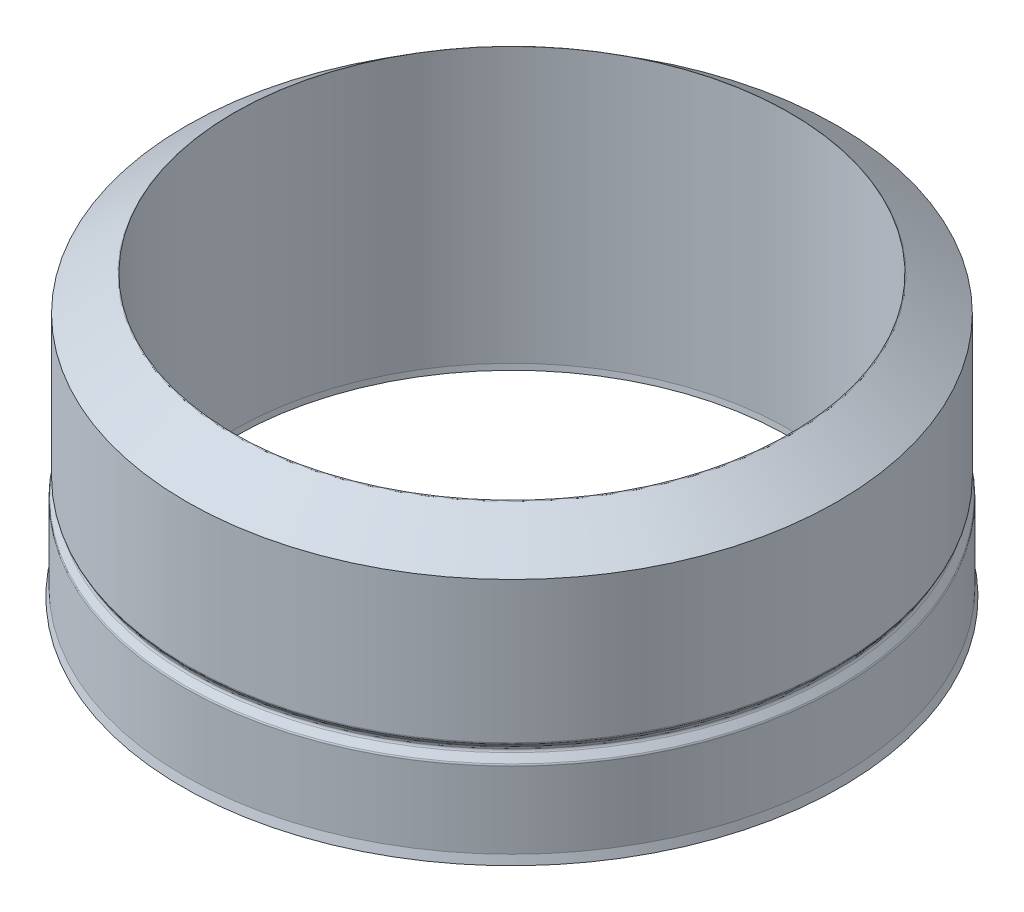
ISO-10303-21;
HEADER;
FILE_DESCRIPTION(('STEP AP214'),'2;1');
FILE_NAME('part.step','',(''),(''),'','','');
FILE_SCHEMA(('AUTOMOTIVE_DESIGN { 1 0 10303 214 1 1 1 1 }'));
ENDSEC;
DATA;
#1=APPLICATION_CONTEXT('core data for automotive mechanical design processes');
#2=APPLICATION_PROTOCOL_DEFINITION('international standard','automotive_design',2000,#1);
#3=PRODUCT_CONTEXT('',#1,'mechanical');
#4=PRODUCT('Part','Part','',(#3));
#5=PRODUCT_RELATED_PRODUCT_CATEGORY('part','',(#4));
#6=PRODUCT_DEFINITION_FORMATION('','',#4);
#7=PRODUCT_DEFINITION_CONTEXT('part definition',#1,'design');
#8=PRODUCT_DEFINITION('design','',#6,#7);
#9=PRODUCT_DEFINITION_SHAPE('','',#8);
#10=(LENGTH_UNIT() NAMED_UNIT(*) SI_UNIT(.MILLI.,.METRE.));
#11=(NAMED_UNIT(*) PLANE_ANGLE_UNIT() SI_UNIT($,.RADIAN.));
#12=(NAMED_UNIT(*) SI_UNIT($,.STERADIAN.) SOLID_ANGLE_UNIT());
#13=UNCERTAINTY_MEASURE_WITH_UNIT(LENGTH_MEASURE(1.E-05),#10,'distance_accuracy_value','');
#14=(GEOMETRIC_REPRESENTATION_CONTEXT(3) GLOBAL_UNCERTAINTY_ASSIGNED_CONTEXT((#13)) GLOBAL_UNIT_ASSIGNED_CONTEXT((#10,
#11,#12)) REPRESENTATION_CONTEXT('',''));
#15=CARTESIAN_POINT('',(0.,0.,0.));
#16=DIRECTION('',(0.,0.,1.));
#17=DIRECTION('',(1.,0.,0.));
#18=AXIS2_PLACEMENT_3D('',#15,#16,#17);
#19=CARTESIAN_POINT('',(-3.20576898360514E-12,-99.9999983932194,0.));
#20=DIRECTION('',(0.,1.,0.));
#21=DIRECTION('',(-1.,0.,0.));
#22=AXIS2_PLACEMENT_3D('',#19,#20,#21);
#23=CONICAL_SURFACE('',#22,198.000371507381,0.12427102554149);
#24=CARTESIAN_POINT('',(-2.71477424169694E-12,-96.0002416542011,0.));
#25=DIRECTION('',(0.,-1.,0.));
#26=DIRECTION('',(-1.,0.,0.));
#27=AXIS2_PLACEMENT_3D('',#24,#25,#26);
#28=CIRCLE('',#27,198.500000000001);
#29=CARTESIAN_POINT('',(-198.500000000004,-96.0002416541993,0.));
#30=VERTEX_POINT('',#29);
#31=EDGE_CURVE('P0_E32',#30,#30,#28,.T.);
#32=ORIENTED_EDGE('',*,*,#31,.F.);
#33=EDGE_LOOP('',(#32));
#34=FACE_BOUND('',#33,.T.);
#35=CARTESIAN_POINT('',(-3.20576898360514E-12,-99.9999983932194,0.));
#36=DIRECTION('',(0.,1.,0.));
#37=DIRECTION('',(-1.,0.,0.));
#38=AXIS2_PLACEMENT_3D('',#35,#36,#37);
#39=CIRCLE('',#38,198.000371507381);
#40=CARTESIAN_POINT('',(-198.000371507385,-99.9999983932176,0.));
#41=VERTEX_POINT('',#40);
#42=EDGE_CURVE('P0_E17',#41,#41,#39,.T.);
#43=ORIENTED_EDGE('',*,*,#42,.F.);
#44=EDGE_LOOP('',(#43));
#45=FACE_BOUND('',#44,.T.);
#46=ADVANCED_FACE('P0_F14',(#34,#45),#23,.F.);
#47=CARTESIAN_POINT('',(-198.250371507384,-99.9999983932175,0.));
#48=DIRECTION('',(0.,-1.,0.));
#49=DIRECTION('',(1.,0.,0.));
#50=AXIS2_PLACEMENT_3D('',#47,#48,#49);
#51=PLANE('',#50);
#52=ORIENTED_EDGE('',*,*,#42,.T.);
#53=EDGE_LOOP('',(#52));
#54=FACE_BOUND('',#53,.T.);
#55=CARTESIAN_POINT('',(-3.20081538125138E-12,-99.9999983932194,0.));
#56=DIRECTION('',(0.,1.,0.));
#57=DIRECTION('',(-1.,0.,0.));
#58=AXIS2_PLACEMENT_3D('',#55,#56,#57);
#59=CIRCLE('',#58,198.500371507381);
#60=CARTESIAN_POINT('',(-198.500371507385,-99.9999983932176,0.));
#61=VERTEX_POINT('',#60);
#62=EDGE_CURVE('P0_E30',#61,#61,#59,.T.);
#63=ORIENTED_EDGE('',*,*,#62,.F.);
#64=EDGE_LOOP('',(#63));
#65=FACE_BOUND('',#64,.T.);
#66=ADVANCED_FACE('P0_F40',(#54,#65),#51,.T.);
#67=CARTESIAN_POINT('',(-2.72004641033163E-12,-96.0002416542011,0.));
#68=DIRECTION('',(0.,1.,0.));
#69=DIRECTION('',(-1.,0.,0.));
#70=AXIS2_PLACEMENT_3D('',#67,#68,#69);
#71=CYLINDRICAL_SURFACE('',#70,198.500000000001);
#72=CARTESIAN_POINT('',(-9.07814435179346E-13,100.00000160678,0.));
#73=DIRECTION('',(0.,-1.,0.));
#74=DIRECTION('',(-1.,0.,0.));
#75=AXIS2_PLACEMENT_3D('',#72,#73,#74);
#76=CIRCLE('',#75,198.500000000001);
#77=CARTESIAN_POINT('',(-198.500000000002,100.000001606782,0.));
#78=VERTEX_POINT('',#77);
#79=EDGE_CURVE('P0_E26',#78,#78,#76,.T.);
#80=ORIENTED_EDGE('',*,*,#79,.F.);
#81=EDGE_LOOP('',(#80));
#82=FACE_BOUND('',#81,.T.);
#83=ORIENTED_EDGE('',*,*,#31,.T.);
#84=EDGE_LOOP('',(#83));
#85=FACE_BOUND('',#84,.T.);
#86=ADVANCED_FACE('P0_F42',(#82,#85),#71,.F.);
#87=CARTESIAN_POINT('',(-3.1641356201817E-12,-96.0002416542011,0.));
#88=DIRECTION('',(0.,1.,0.));
#89=DIRECTION('',(-1.,0.,0.));
#90=AXIS2_PLACEMENT_3D('',#87,#88,#89);
#91=CONICAL_SURFACE('',#90,199.,0.124271025541489);
#92=ORIENTED_EDGE('',*,*,#62,.T.);
#93=EDGE_LOOP('',(#92));
#94=FACE_BOUND('',#93,.T.);
#95=CARTESIAN_POINT('',(-2.71309397510336E-12,-96.0002416542011,0.));
#96=DIRECTION('',(0.,1.,0.));
#97=DIRECTION('',(-1.,0.,0.));
#98=AXIS2_PLACEMENT_3D('',#95,#96,#97);
#99=CIRCLE('',#98,199.000000000001);
#100=CARTESIAN_POINT('',(-199.000000000004,-96.0002416541993,0.));
#101=VERTEX_POINT('',#100);
#102=EDGE_CURVE('P0_E21',#101,#101,#99,.T.);
#103=ORIENTED_EDGE('',*,*,#102,.F.);
#104=EDGE_LOOP('',(#103));
#105=FACE_BOUND('',#104,.T.);
#106=ADVANCED_FACE('P0_F37',(#94,#105),#91,.T.);
#107=CARTESIAN_POINT('',(-9.0205620750794E-13,99.6323545479566,0.));
#108=DIRECTION('',(0.,-1.,0.));
#109=DIRECTION('',(1.,0.,0.));
#110=AXIS2_PLACEMENT_3D('',#107,#108,#109);
#111=CONICAL_SURFACE('',#110,199.000000000001,0.936773607131611);
#112=ORIENTED_EDGE('',*,*,#79,.T.);
#113=EDGE_LOOP('',(#112));
#114=FACE_BOUND('',#113,.T.);
#115=CARTESIAN_POINT('',(-9.24884831988349E-13,99.6323545479572,0.));
#116=DIRECTION('',(0.,1.,0.));
#117=DIRECTION('',(-1.,0.,0.));
#118=AXIS2_PLACEMENT_3D('',#115,#116,#117);
#119=CIRCLE('',#118,199.000000000001);
#120=CARTESIAN_POINT('',(-199.000000000002,99.632354547959,0.));
#121=VERTEX_POINT('',#120);
#122=EDGE_CURVE('P0_E10',#121,#121,#119,.F.);
#123=ORIENTED_EDGE('',*,*,#122,.F.);
#124=EDGE_LOOP('',(#123));
#125=FACE_BOUND('',#124,.T.);
#126=ADVANCED_FACE('P0_F55',(#114,#125),#111,.T.);
#127=CARTESIAN_POINT('',(-1.81898940354586E-12,1.81605644687806,0.));
#128=DIRECTION('',(0.,1.,0.));
#129=DIRECTION('',(-1.,0.,0.));
#130=AXIS2_PLACEMENT_3D('',#127,#128,#129);
#131=CYLINDRICAL_SURFACE('',#130,199.000000000001);
#132=ORIENTED_EDGE('',*,*,#102,.T.);
#133=EDGE_LOOP('',(#132));
#134=FACE_BOUND('',#133,.T.);
#135=ORIENTED_EDGE('',*,*,#122,.T.);
#136=EDGE_LOOP('',(#135));
#137=FACE_BOUND('',#136,.T.);
#138=ADVANCED_FACE('P0_F53',(#134,#137),#131,.T.);
#139=CLOSED_SHELL('',(#46,#66,#86,#106,#126,#138));
#140=MANIFOLD_SOLID_BREP('P0_B1',#139);
#141=CARTESIAN_POINT('',(0.,-94.0000016067843,0.));
#142=DIRECTION('',(0.,1.,0.));
#143=DIRECTION('',(0.,0.,1.));
#144=AXIS2_PLACEMENT_3D('',#141,#142,#143);
#145=CYLINDRICAL_SURFACE('',#144,233.350000000005);
#146=CARTESIAN_POINT('',(0.,-94.0000016067843,0.));
#147=DIRECTION('',(0.,-1.,0.));
#148=DIRECTION('',(-1.,0.,0.));
#149=AXIS2_PLACEMENT_3D('',#146,#147,#148);
#150=CIRCLE('',#149,233.350000000005);
#151=CARTESIAN_POINT('',(-233.350000000005,-94.0000016067843,0.));
#152=VERTEX_POINT('',#151);
#153=EDGE_CURVE('P1_E158',#152,#152,#150,.F.);
#154=ORIENTED_EDGE('',*,*,#153,.F.);
#155=EDGE_LOOP('',(#154));
#156=FACE_BOUND('',#155,.T.);
#157=CARTESIAN_POINT('',(0.,-39.5414317413342,0.));
#158=DIRECTION('',(0.,1.,0.));
#159=DIRECTION('',(1.,0.,0.));
#160=AXIS2_PLACEMENT_3D('',#157,#158,#159);
#161=CIRCLE('',#160,233.350000000005);
#162=CARTESIAN_POINT('',(233.350000000005,-39.5414317413342,0.));
#163=VERTEX_POINT('',#162);
#164=EDGE_CURVE('P1_E161',#163,#163,#161,.F.);
#165=ORIENTED_EDGE('',*,*,#164,.F.);
#166=EDGE_LOOP('',(#165));
#167=FACE_BOUND('',#166,.T.);
#168=ADVANCED_FACE('P1_F14',(#156,#167),#145,.F.);
#169=CARTESIAN_POINT('',(0.,-94.0000016067844,0.));
#170=DIRECTION('',(0.,-1.,0.));
#171=DIRECTION('',(0.,0.,-1.));
#172=AXIS2_PLACEMENT_3D('',#169,#170,#171);
#173=CONICAL_SURFACE('',#172,233.350000000005,0.246413690323562);
#174=CARTESIAN_POINT('',(0.,-100.000001606786,0.));
#175=DIRECTION('',(0.,-1.,0.));
#176=DIRECTION('',(0.,0.,-1.));
#177=AXIS2_PLACEMENT_3D('',#174,#175,#176);
#178=CIRCLE('',#177,234.85915158786);
#179=CARTESIAN_POINT('',(0.,-100.000001606786,-234.85915158786));
#180=VERTEX_POINT('',#179);
#181=EDGE_CURVE('P1_E17',#180,#180,#178,.F.);
#182=ORIENTED_EDGE('',*,*,#181,.F.);
#183=EDGE_LOOP('',(#182));
#184=FACE_BOUND('',#183,.T.);
#185=ORIENTED_EDGE('',*,*,#153,.T.);
#186=EDGE_LOOP('',(#185));
#187=FACE_BOUND('',#186,.T.);
#188=ADVANCED_FACE('P1_F153',(#184,#187),#173,.F.);
#189=CARTESIAN_POINT('',(0.,-39.5414317413342,0.));
#190=DIRECTION('',(0.,1.,0.));
#191=DIRECTION('',(1.,0.,0.));
#192=AXIS2_PLACEMENT_3D('',#189,#190,#191);
#193=TOROIDAL_SURFACE('',#192,231.350000000003,2.00000000000204);
#194=CARTESIAN_POINT('',(0.,-38.3497733500738,0.));
#195=DIRECTION('',(0.,-1.,0.));
#196=DIRECTION('',(-1.,0.,0.));
#197=AXIS2_PLACEMENT_3D('',#194,#195,#196);
#198=CIRCLE('',#197,232.956222362735);
#199=CARTESIAN_POINT('',(-232.956222362735,-38.3497733500738,0.));
#200=VERTEX_POINT('',#199);
#201=EDGE_CURVE('P1_E165',#200,#200,#198,.T.);
#202=ORIENTED_EDGE('',*,*,#201,.F.);
#203=EDGE_LOOP('',(#202));
#204=FACE_BOUND('',#203,.T.);
#205=ORIENTED_EDGE('',*,*,#164,.T.);
#206=EDGE_LOOP('',(#205));
#207=FACE_BOUND('',#206,.T.);
#208=ADVANCED_FACE('P1_F149',(#204,#207),#193,.F.);
#209=CARTESIAN_POINT('',(-235.109151587861,-100.000001606786,0.));
#210=DIRECTION('',(0.,-1.,0.));
#211=DIRECTION('',(0.,0.,-1.));
#212=AXIS2_PLACEMENT_3D('',#209,#210,#211);
#213=PLANE('',#212);
#214=ORIENTED_EDGE('',*,*,#181,.T.);
#215=EDGE_LOOP('',(#214));
#216=FACE_BOUND('',#215,.T.);
#217=CARTESIAN_POINT('',(0.,-100.000001606786,0.));
#218=DIRECTION('',(0.,-1.,0.));
#219=DIRECTION('',(0.,0.,-1.));
#220=AXIS2_PLACEMENT_3D('',#217,#218,#219);
#221=CIRCLE('',#220,235.35915158786);
#222=CARTESIAN_POINT('',(0.,-100.000001606786,-235.35915158786));
#223=VERTEX_POINT('',#222);
#224=EDGE_CURVE('P1_E163',#223,#223,#221,.F.);
#225=ORIENTED_EDGE('',*,*,#224,.F.);
#226=EDGE_LOOP('',(#225));
#227=FACE_BOUND('',#226,.T.);
#228=ADVANCED_FACE('P1_F145',(#216,#227),#213,.T.);
#229=CARTESIAN_POINT('',(0.,-33.8133800344971,0.));
#230=DIRECTION('',(0.,-1.,0.));
#231=DIRECTION('',(0.,0.,-1.));
#232=AXIS2_PLACEMENT_3D('',#229,#230,#231);
#233=CONICAL_SURFACE('',#232,229.590666455906,0.638297732998364);
#234=ORIENTED_EDGE('',*,*,#201,.T.);
#235=EDGE_LOOP('',(#234));
#236=FACE_BOUND('',#235,.T.);
#237=CARTESIAN_POINT('',(0.,-33.8133800344963,0.));
#238=DIRECTION('',(0.,1.,0.));
#239=DIRECTION('',(1.,0.,0.));
#240=AXIS2_PLACEMENT_3D('',#237,#238,#239);
#241=CIRCLE('',#240,229.590666455907);
#242=CARTESIAN_POINT('',(229.590666455907,-33.8133800344963,0.));
#243=VERTEX_POINT('',#242);
#244=EDGE_CURVE('P1_E130',#243,#243,#241,.F.);
#245=ORIENTED_EDGE('',*,*,#244,.F.);
#246=EDGE_LOOP('',(#245));
#247=FACE_BOUND('',#246,.T.);
#248=ADVANCED_FACE('P1_F141',(#236,#247),#233,.F.);
#249=CARTESIAN_POINT('',(0.,-100.000001606786,0.));
#250=DIRECTION('',(0.,-1.,0.));
#251=DIRECTION('',(0.,0.,-1.));
#252=AXIS2_PLACEMENT_3D('',#249,#250,#251);
#253=CONICAL_SURFACE('',#252,235.35915158786,0.246413690323564);
#254=CARTESIAN_POINT('',(0.,-94.0000016067843,0.));
#255=DIRECTION('',(0.,1.,0.));
#256=DIRECTION('',(0.,0.,1.));
#257=AXIS2_PLACEMENT_3D('',#254,#255,#256);
#258=CIRCLE('',#257,233.850000000005);
#259=CARTESIAN_POINT('',(0.,-94.0000016067843,233.850000000005));
#260=VERTEX_POINT('',#259);
#261=EDGE_CURVE('P1_E127',#260,#260,#258,.T.);
#262=ORIENTED_EDGE('',*,*,#261,.F.);
#263=EDGE_LOOP('',(#262));
#264=FACE_BOUND('',#263,.T.);
#265=ORIENTED_EDGE('',*,*,#224,.T.);
#266=EDGE_LOOP('',(#265));
#267=FACE_BOUND('',#266,.T.);
#268=ADVANCED_FACE('P1_F137',(#264,#267),#253,.T.);
#269=CARTESIAN_POINT('',(0.,-32.0258924476111,0.));
#270=DIRECTION('',(0.,1.,0.));
#271=DIRECTION('',(1.,0.,0.));
#272=AXIS2_PLACEMENT_3D('',#269,#270,#271);
#273=TOROIDAL_SURFACE('',#272,231.999999999982,2.99999999997906);
#274=CARTESIAN_POINT('',(0.,-32.0258924476075,0.));
#275=DIRECTION('',(0.,-1.,0.));
#276=DIRECTION('',(-1.,0.,0.));
#277=AXIS2_PLACEMENT_3D('',#274,#275,#276);
#278=CIRCLE('',#277,229.000000000003);
#279=CARTESIAN_POINT('',(-229.000000000003,-32.0258924476075,0.));
#280=VERTEX_POINT('',#279);
#281=EDGE_CURVE('P1_E124',#280,#280,#278,.T.);
#282=ORIENTED_EDGE('',*,*,#281,.F.);
#283=EDGE_LOOP('',(#282));
#284=FACE_BOUND('',#283,.T.);
#285=ORIENTED_EDGE('',*,*,#244,.T.);
#286=EDGE_LOOP('',(#285));
#287=FACE_BOUND('',#286,.T.);
#288=ADVANCED_FACE('P1_F133',(#284,#287),#273,.T.);
#289=CARTESIAN_POINT('',(0.,-66.7707166740602,0.));
#290=DIRECTION('',(0.,1.,0.));
#291=DIRECTION('',(0.,0.,1.));
#292=AXIS2_PLACEMENT_3D('',#289,#290,#291);
#293=CYLINDRICAL_SURFACE('',#292,233.850000000005);
#294=CARTESIAN_POINT('',(0.,-39.5414317413342,0.));
#295=DIRECTION('',(0.,1.,0.));
#296=DIRECTION('',(1.,0.,0.));
#297=AXIS2_PLACEMENT_3D('',#294,#295,#296);
#298=CIRCLE('',#297,233.850000000005);
#299=CARTESIAN_POINT('',(233.850000000005,-39.5414317413342,0.));
#300=VERTEX_POINT('',#299);
#301=EDGE_CURVE('P1_E121',#300,#300,#298,.T.);
#302=ORIENTED_EDGE('',*,*,#301,.F.);
#303=EDGE_LOOP('',(#302));
#304=FACE_BOUND('',#303,.T.);
#305=ORIENTED_EDGE('',*,*,#261,.T.);
#306=EDGE_LOOP('',(#305));
#307=FACE_BOUND('',#306,.T.);
#308=ADVANCED_FACE('P1_F136',(#304,#307),#293,.T.);
#309=CARTESIAN_POINT('',(0.,-32.0258924476075,0.));
#310=DIRECTION('',(0.,1.,0.));
#311=DIRECTION('',(0.,0.,1.));
#312=AXIS2_PLACEMENT_3D('',#309,#310,#311);
#313=CYLINDRICAL_SURFACE('',#312,229.000000000003);
#314=ORIENTED_EDGE('',*,*,#281,.T.);
#315=EDGE_LOOP('',(#314));
#316=FACE_BOUND('',#315,.T.);
#317=CARTESIAN_POINT('',(0.,-31.6958924476057,0.));
#318=DIRECTION('',(0.,1.,0.));
#319=DIRECTION('',(1.,0.,0.));
#320=AXIS2_PLACEMENT_3D('',#317,#318,#319);
#321=CIRCLE('',#320,229.000000000003);
#322=CARTESIAN_POINT('',(229.000000000003,-31.6958924476057,0.));
#323=VERTEX_POINT('',#322);
#324=EDGE_CURVE('P1_E103',#323,#323,#321,.F.);
#325=ORIENTED_EDGE('',*,*,#324,.F.);
#326=EDGE_LOOP('',(#325));
#327=FACE_BOUND('',#326,.T.);
#328=ADVANCED_FACE('P1_F116',(#316,#327),#313,.F.);
#329=CARTESIAN_POINT('',(0.,-39.5414317413342,0.));
#330=DIRECTION('',(0.,1.,0.));
#331=DIRECTION('',(1.,0.,0.));
#332=AXIS2_PLACEMENT_3D('',#329,#330,#331);
#333=TOROIDAL_SURFACE('',#332,231.850000000003,2.00000000000204);
#334=ORIENTED_EDGE('',*,*,#301,.T.);
#335=EDGE_LOOP('',(#334));
#336=FACE_BOUND('',#335,.T.);
#337=CARTESIAN_POINT('',(0.,-38.3497733500738,0.));
#338=DIRECTION('',(0.,-1.,0.));
#339=DIRECTION('',(-1.,0.,0.));
#340=AXIS2_PLACEMENT_3D('',#337,#338,#339);
#341=CIRCLE('',#340,233.456222362735);
#342=CARTESIAN_POINT('',(-233.456222362735,-38.3497733500738,0.));
#343=VERTEX_POINT('',#342);
#344=EDGE_CURVE('P1_E100',#343,#343,#341,.F.);
#345=ORIENTED_EDGE('',*,*,#344,.F.);
#346=EDGE_LOOP('',(#345));
#347=FACE_BOUND('',#346,.T.);
#348=ADVANCED_FACE('P1_F112',(#336,#347),#333,.T.);
#349=CARTESIAN_POINT('',(0.,-31.6958924476039,0.));
#350=DIRECTION('',(0.,1.,0.));
#351=DIRECTION('',(1.,0.,0.));
#352=AXIS2_PLACEMENT_3D('',#349,#350,#351);
#353=TOROIDAL_SURFACE('',#352,231.999999999982,2.99999999997951);
#354=CARTESIAN_POINT('',(0.,-29.9084048607165,0.));
#355=DIRECTION('',(0.,1.,0.));
#356=DIRECTION('',(-1.,0.,0.));
#357=AXIS2_PLACEMENT_3D('',#354,#355,#356);
#358=CIRCLE('',#357,229.590666455907);
#359=CARTESIAN_POINT('',(-229.590666455907,-29.9084048607165,0.));
#360=VERTEX_POINT('',#359);
#361=EDGE_CURVE('P1_E97',#360,#360,#358,.F.);
#362=ORIENTED_EDGE('',*,*,#361,.F.);
#363=EDGE_LOOP('',(#362));
#364=FACE_BOUND('',#363,.T.);
#365=ORIENTED_EDGE('',*,*,#324,.T.);
#366=EDGE_LOOP('',(#365));
#367=FACE_BOUND('',#366,.T.);
#368=ADVANCED_FACE('P1_F108',(#364,#367),#353,.T.);
#369=CARTESIAN_POINT('',(0.,-38.3497733500738,0.));
#370=DIRECTION('',(0.,-1.,0.));
#371=DIRECTION('',(0.,0.,-1.));
#372=AXIS2_PLACEMENT_3D('',#369,#370,#371);
#373=CONICAL_SURFACE('',#372,233.456222362735,0.638297732998364);
#374=CARTESIAN_POINT('',(0.,-33.8133800344963,0.));
#375=DIRECTION('',(0.,1.,0.));
#376=DIRECTION('',(1.,0.,0.));
#377=AXIS2_PLACEMENT_3D('',#374,#375,#376);
#378=CIRCLE('',#377,230.090666455907);
#379=CARTESIAN_POINT('',(230.090666455907,-33.8133800344963,0.));
#380=VERTEX_POINT('',#379);
#381=EDGE_CURVE('P1_E94',#380,#380,#378,.T.);
#382=ORIENTED_EDGE('',*,*,#381,.F.);
#383=EDGE_LOOP('',(#382));
#384=FACE_BOUND('',#383,.T.);
#385=ORIENTED_EDGE('',*,*,#344,.T.);
#386=EDGE_LOOP('',(#385));
#387=FACE_BOUND('',#386,.T.);
#388=ADVANCED_FACE('P1_F111',(#384,#387),#373,.T.);
#389=CARTESIAN_POINT('',(0.,-29.9084048607165,0.));
#390=DIRECTION('',(0.,1.,0.));
#391=DIRECTION('',(0.,0.,1.));
#392=AXIS2_PLACEMENT_3D('',#389,#390,#391);
#393=CONICAL_SURFACE('',#392,229.590666455907,0.638297732997769);
#394=ORIENTED_EDGE('',*,*,#361,.T.);
#395=EDGE_LOOP('',(#394));
#396=FACE_BOUND('',#395,.T.);
#397=CARTESIAN_POINT('',(0.,-27.1916607043221,0.));
#398=DIRECTION('',(0.,1.,0.));
#399=DIRECTION('',(1.,0.,0.));
#400=AXIS2_PLACEMENT_3D('',#397,#398,#399);
#401=CIRCLE('',#400,231.60622236273);
#402=CARTESIAN_POINT('',(231.60622236273,-27.1916607043221,0.));
#403=VERTEX_POINT('',#402);
#404=EDGE_CURVE('P1_E76',#403,#403,#401,.F.);
#405=ORIENTED_EDGE('',*,*,#404,.F.);
#406=EDGE_LOOP('',(#405));
#407=FACE_BOUND('',#406,.T.);
#408=ADVANCED_FACE('P1_F89',(#396,#407),#393,.F.);
#409=CARTESIAN_POINT('',(0.,-32.0258924476111,0.));
#410=DIRECTION('',(0.,1.,0.));
#411=DIRECTION('',(1.,0.,0.));
#412=AXIS2_PLACEMENT_3D('',#409,#410,#411);
#413=TOROIDAL_SURFACE('',#412,232.499999999982,2.99999999997906);
#414=ORIENTED_EDGE('',*,*,#381,.T.);
#415=EDGE_LOOP('',(#414));
#416=FACE_BOUND('',#415,.T.);
#417=CARTESIAN_POINT('',(0.,-32.0258924476075,0.));
#418=DIRECTION('',(0.,1.,0.));
#419=DIRECTION('',(0.,0.,1.));
#420=AXIS2_PLACEMENT_3D('',#417,#418,#419);
#421=CIRCLE('',#420,229.500000000003);
#422=CARTESIAN_POINT('',(0.,-32.0258924476075,229.500000000003));
#423=VERTEX_POINT('',#422);
#424=EDGE_CURVE('P1_E73',#423,#423,#421,.T.);
#425=ORIENTED_EDGE('',*,*,#424,.F.);
#426=EDGE_LOOP('',(#425));
#427=FACE_BOUND('',#426,.T.);
#428=ADVANCED_FACE('P1_F85',(#416,#427),#413,.F.);
#429=CARTESIAN_POINT('',(0.,-26.0000023130615,0.));
#430=DIRECTION('',(0.,1.,0.));
#431=DIRECTION('',(1.,0.,0.));
#432=AXIS2_PLACEMENT_3D('',#429,#430,#431);
#433=TOROIDAL_SURFACE('',#432,230.,1.99999999999957);
#434=CARTESIAN_POINT('',(0.,-26.0000023130615,0.));
#435=DIRECTION('',(0.,-1.,0.));
#436=DIRECTION('',(-1.,0.,0.));
#437=AXIS2_PLACEMENT_3D('',#434,#435,#436);
#438=CIRCLE('',#437,231.999999999999);
#439=CARTESIAN_POINT('',(-231.999999999999,-26.0000023130615,0.));
#440=VERTEX_POINT('',#439);
#441=EDGE_CURVE('P1_E70',#440,#440,#438,.T.);
#442=ORIENTED_EDGE('',*,*,#441,.F.);
#443=EDGE_LOOP('',(#442));
#444=FACE_BOUND('',#443,.T.);
#445=ORIENTED_EDGE('',*,*,#404,.T.);
#446=EDGE_LOOP('',(#445));
#447=FACE_BOUND('',#446,.T.);
#448=ADVANCED_FACE('P1_F81',(#444,#447),#433,.F.);
#449=CARTESIAN_POINT('',(0.,-31.8608924476066,0.));
#450=DIRECTION('',(0.,1.,0.));
#451=DIRECTION('',(0.,0.,1.));
#452=AXIS2_PLACEMENT_3D('',#449,#450,#451);
#453=CYLINDRICAL_SURFACE('',#452,229.500000000003);
#454=CARTESIAN_POINT('',(0.,-31.6958924476057,0.));
#455=DIRECTION('',(0.,1.,0.));
#456=DIRECTION('',(1.,0.,0.));
#457=AXIS2_PLACEMENT_3D('',#454,#455,#456);
#458=CIRCLE('',#457,229.500000000003);
#459=CARTESIAN_POINT('',(229.500000000003,-31.6958924476057,0.));
#460=VERTEX_POINT('',#459);
#461=EDGE_CURVE('P1_E67',#460,#460,#458,.T.);
#462=ORIENTED_EDGE('',*,*,#461,.F.);
#463=EDGE_LOOP('',(#462));
#464=FACE_BOUND('',#463,.T.);
#465=ORIENTED_EDGE('',*,*,#424,.T.);
#466=EDGE_LOOP('',(#465));
#467=FACE_BOUND('',#466,.T.);
#468=ADVANCED_FACE('P1_F84',(#464,#467),#453,.T.);
#469=CARTESIAN_POINT('',(0.,-26.0000023130615,0.));
#470=DIRECTION('',(0.,1.,0.));
#471=DIRECTION('',(0.,0.,1.));
#472=AXIS2_PLACEMENT_3D('',#469,#470,#471);
#473=CYLINDRICAL_SURFACE('',#472,231.999999999999);
#474=CARTESIAN_POINT('',(0.,75.0000016067819,0.));
#475=DIRECTION('',(0.,-1.,0.));
#476=DIRECTION('',(-1.,0.,0.));
#477=AXIS2_PLACEMENT_3D('',#474,#475,#476);
#478=CIRCLE('',#477,232.);
#479=CARTESIAN_POINT('',(-232.,75.0000016067819,0.));
#480=VERTEX_POINT('',#479);
#481=EDGE_CURVE('P1_E65',#480,#480,#478,.T.);
#482=ORIENTED_EDGE('',*,*,#481,.F.);
#483=EDGE_LOOP('',(#482));
#484=FACE_BOUND('',#483,.T.);
#485=ORIENTED_EDGE('',*,*,#441,.T.);
#486=EDGE_LOOP('',(#485));
#487=FACE_BOUND('',#486,.T.);
#488=ADVANCED_FACE('P1_F59',(#484,#487),#473,.F.);
#489=CARTESIAN_POINT('',(0.,-31.6958924476039,0.));
#490=DIRECTION('',(0.,1.,0.));
#491=DIRECTION('',(1.,0.,0.));
#492=AXIS2_PLACEMENT_3D('',#489,#490,#491);
#493=TOROIDAL_SURFACE('',#492,232.499999999982,2.99999999997951);
#494=ORIENTED_EDGE('',*,*,#461,.T.);
#495=EDGE_LOOP('',(#494));
#496=FACE_BOUND('',#495,.T.);
#497=CARTESIAN_POINT('',(0.,-29.9084048607165,0.));
#498=DIRECTION('',(0.,1.,0.));
#499=DIRECTION('',(-1.,0.,0.));
#500=AXIS2_PLACEMENT_3D('',#497,#498,#499);
#501=CIRCLE('',#500,230.090666455907);
#502=CARTESIAN_POINT('',(-230.090666455907,-29.9084048607165,0.));
#503=VERTEX_POINT('',#502);
#504=EDGE_CURVE('P1_E333',#503,#503,#501,.T.);
#505=ORIENTED_EDGE('',*,*,#504,.F.);
#506=EDGE_LOOP('',(#505));
#507=FACE_BOUND('',#506,.T.);
#508=ADVANCED_FACE('P1_F54',(#496,#507),#493,.F.);
#509=CARTESIAN_POINT('',(0.,99.8883834710335,0.));
#510=DIRECTION('',(0.,-1.,0.));
#511=DIRECTION('',(0.,0.,-1.));
#512=AXIS2_PLACEMENT_3D('',#509,#510,#511);
#513=CONICAL_SURFACE('',#512,198.500000000002,0.931831030868231);
#514=CARTESIAN_POINT('',(0.,99.8883834710341,0.));
#515=DIRECTION('',(0.,-1.,0.));
#516=DIRECTION('',(-1.,0.,0.));
#517=AXIS2_PLACEMENT_3D('',#514,#515,#516);
#518=CIRCLE('',#517,198.500000000003);
#519=CARTESIAN_POINT('',(-198.500000000003,99.8883834710341,0.));
#520=VERTEX_POINT('',#519);
#521=EDGE_CURVE('P1_E335',#520,#520,#518,.T.);
#522=ORIENTED_EDGE('',*,*,#521,.F.);
#523=EDGE_LOOP('',(#522));
#524=FACE_BOUND('',#523,.T.);
#525=ORIENTED_EDGE('',*,*,#481,.T.);
#526=EDGE_LOOP('',(#525));
#527=FACE_BOUND('',#526,.T.);
#528=ADVANCED_FACE('P1_F50',(#524,#527),#513,.F.);
#529=CARTESIAN_POINT('',(0.,-27.1916607043222,0.));
#530=DIRECTION('',(0.,1.,0.));
#531=DIRECTION('',(0.,0.,1.));
#532=AXIS2_PLACEMENT_3D('',#529,#530,#531);
#533=CONICAL_SURFACE('',#532,232.10622236273,0.638297732997765);
#534=CARTESIAN_POINT('',(0.,-27.1916607043221,0.));
#535=DIRECTION('',(0.,1.,0.));
#536=DIRECTION('',(1.,0.,0.));
#537=AXIS2_PLACEMENT_3D('',#534,#535,#536);
#538=CIRCLE('',#537,232.10622236273);
#539=CARTESIAN_POINT('',(232.10622236273,-27.1916607043221,0.));
#540=VERTEX_POINT('',#539);
#541=EDGE_CURVE('P1_E31',#540,#540,#538,.T.);
#542=ORIENTED_EDGE('',*,*,#541,.F.);
#543=EDGE_LOOP('',(#542));
#544=FACE_BOUND('',#543,.T.);
#545=ORIENTED_EDGE('',*,*,#504,.T.);
#546=EDGE_LOOP('',(#545));
#547=FACE_BOUND('',#546,.T.);
#548=ADVANCED_FACE('P1_F46',(#544,#547),#533,.T.);
#549=CARTESIAN_POINT('',(0.,99.8883834710341,0.));
#550=DIRECTION('',(0.,1.,0.));
#551=DIRECTION('',(0.,0.,1.));
#552=AXIS2_PLACEMENT_3D('',#549,#550,#551);
#553=CYLINDRICAL_SURFACE('',#552,198.500000000003);
#554=ORIENTED_EDGE('',*,*,#521,.T.);
#555=EDGE_LOOP('',(#554));
#556=FACE_BOUND('',#555,.T.);
#557=CARTESIAN_POINT('',(0.,100.000001606782,0.));
#558=DIRECTION('',(0.,-1.,0.));
#559=DIRECTION('',(-1.,0.,0.));
#560=AXIS2_PLACEMENT_3D('',#557,#558,#559);
#561=CIRCLE('',#560,198.500000000003);
#562=CARTESIAN_POINT('',(-198.500000000003,100.000001606782,0.));
#563=VERTEX_POINT('',#562);
#564=EDGE_CURVE('P1_E26',#563,#563,#561,.T.);
#565=ORIENTED_EDGE('',*,*,#564,.F.);
#566=EDGE_LOOP('',(#565));
#567=FACE_BOUND('',#566,.T.);
#568=ADVANCED_FACE('P1_F41',(#556,#567),#553,.F.);
#569=CARTESIAN_POINT('',(0.,-26.0000023130615,0.));
#570=DIRECTION('',(0.,1.,0.));
#571=DIRECTION('',(1.,0.,0.));
#572=AXIS2_PLACEMENT_3D('',#569,#570,#571);
#573=TOROIDAL_SURFACE('',#572,230.5,1.99999999999957);
#574=ORIENTED_EDGE('',*,*,#541,.T.);
#575=EDGE_LOOP('',(#574));
#576=FACE_BOUND('',#575,.T.);
#577=CARTESIAN_POINT('',(0.,-26.0000023130615,0.));
#578=DIRECTION('',(0.,1.,0.));
#579=DIRECTION('',(0.,0.,1.));
#580=AXIS2_PLACEMENT_3D('',#577,#578,#579);
#581=CIRCLE('',#580,232.5);
#582=CARTESIAN_POINT('',(0.,-26.0000023130615,232.5));
#583=VERTEX_POINT('',#582);
#584=EDGE_CURVE('P1_E21',#583,#583,#581,.T.);
#585=ORIENTED_EDGE('',*,*,#584,.F.);
#586=EDGE_LOOP('',(#585));
#587=FACE_BOUND('',#586,.T.);
#588=ADVANCED_FACE('P1_F36',(#576,#587),#573,.T.);
#589=CARTESIAN_POINT('',(0.,75.0000016067861,0.));
#590=DIRECTION('',(0.,-1.,0.));
#591=DIRECTION('',(0.,0.,-1.));
#592=AXIS2_PLACEMENT_3D('',#589,#590,#591);
#593=CONICAL_SURFACE('',#592,232.5,0.936773607131505);
#594=CARTESIAN_POINT('',(0.,75.0000016067861,0.));
#595=DIRECTION('',(0.,1.,0.));
#596=DIRECTION('',(0.,0.,1.));
#597=AXIS2_PLACEMENT_3D('',#594,#595,#596);
#598=CIRCLE('',#597,232.5);
#599=CARTESIAN_POINT('',(0.,75.0000016067861,232.5));
#600=VERTEX_POINT('',#599);
#601=EDGE_CURVE('P1_E10',#600,#600,#598,.F.);
#602=ORIENTED_EDGE('',*,*,#601,.F.);
#603=EDGE_LOOP('',(#602));
#604=FACE_BOUND('',#603,.T.);
#605=ORIENTED_EDGE('',*,*,#564,.T.);
#606=EDGE_LOOP('',(#605));
#607=FACE_BOUND('',#606,.T.);
#608=ADVANCED_FACE('P1_F40',(#604,#607),#593,.T.);
#609=CARTESIAN_POINT('',(0.,50.0000016067843,0.));
#610=DIRECTION('',(0.,1.,0.));
#611=DIRECTION('',(0.,0.,1.));
#612=AXIS2_PLACEMENT_3D('',#609,#610,#611);
#613=CYLINDRICAL_SURFACE('',#612,232.5);
#614=ORIENTED_EDGE('',*,*,#584,.T.);
#615=EDGE_LOOP('',(#614));
#616=FACE_BOUND('',#615,.T.);
#617=ORIENTED_EDGE('',*,*,#601,.T.);
#618=EDGE_LOOP('',(#617));
#619=FACE_BOUND('',#618,.T.);
#620=ADVANCED_FACE('P1_F186',(#616,#619),#613,.T.);
#621=CLOSED_SHELL('',(#168,#188,#208,#228,#248,#268,#288,#308,#328,#348,#368,#388,#408,#428,
#448,#468,#488,#508,#528,#548,#568,#588,#608,#620));
#622=MANIFOLD_SOLID_BREP('P1_B1',#621);
#623=ADVANCED_BREP_SHAPE_REPRESENTATION('',(#18,#140,#622),#14);
#624=SHAPE_DEFINITION_REPRESENTATION(#9,#623);
ENDSEC;
END-ISO-10303-21;
